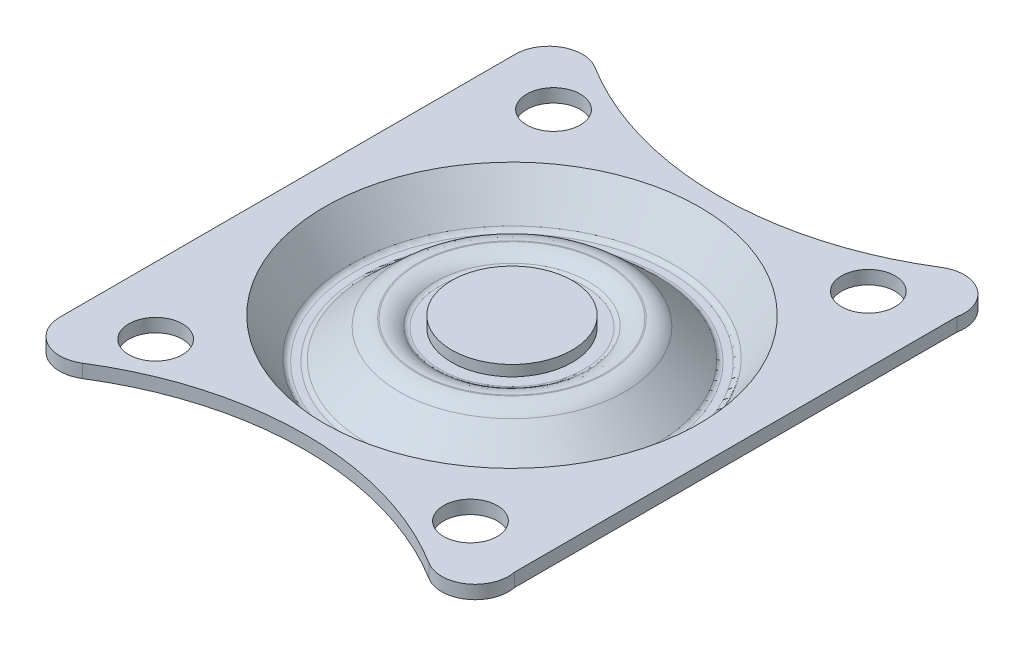
ISO-10303-21;
HEADER;
FILE_DESCRIPTION(('STEP AP214'),'2;1');
FILE_NAME('part.step','',(''),(''),'','','');
FILE_SCHEMA(('AUTOMOTIVE_DESIGN { 1 0 10303 214 1 1 1 1 }'));
ENDSEC;
DATA;
#1=APPLICATION_CONTEXT('core data for automotive mechanical design processes');
#2=APPLICATION_PROTOCOL_DEFINITION('international standard','automotive_design',2000,#1);
#3=PRODUCT_CONTEXT('',#1,'mechanical');
#4=PRODUCT('Part','Part','',(#3));
#5=PRODUCT_RELATED_PRODUCT_CATEGORY('part','',(#4));
#6=PRODUCT_DEFINITION_FORMATION('','',#4);
#7=PRODUCT_DEFINITION_CONTEXT('part definition',#1,'design');
#8=PRODUCT_DEFINITION('design','',#6,#7);
#9=PRODUCT_DEFINITION_SHAPE('','',#8);
#10=(LENGTH_UNIT() NAMED_UNIT(*) SI_UNIT(.MILLI.,.METRE.));
#11=(NAMED_UNIT(*) PLANE_ANGLE_UNIT() SI_UNIT($,.RADIAN.));
#12=(NAMED_UNIT(*) SI_UNIT($,.STERADIAN.) SOLID_ANGLE_UNIT());
#13=UNCERTAINTY_MEASURE_WITH_UNIT(LENGTH_MEASURE(1.E-05),#10,'distance_accuracy_value','');
#14=(GEOMETRIC_REPRESENTATION_CONTEXT(3) GLOBAL_UNCERTAINTY_ASSIGNED_CONTEXT((#13)) GLOBAL_UNIT_ASSIGNED_CONTEXT((#10,
#11,#12)) REPRESENTATION_CONTEXT('',''));
#15=CARTESIAN_POINT('',(0.,0.,0.));
#16=DIRECTION('',(0.,0.,1.));
#17=DIRECTION('',(1.,0.,0.));
#18=AXIS2_PLACEMENT_3D('',#15,#16,#17);
#19=CARTESIAN_POINT('',(-7.00309543866704,-1.94184567149119,-2.90077710928894));
#20=DIRECTION('',(0.,1.,0.));
#21=DIRECTION('',(-0.923879532511292,0.,-0.382683432365077));
#22=AXIS2_PLACEMENT_3D('',#19,#20,#21);
#23=SPHERICAL_SURFACE('',#22,1.5);
#24=CARTESIAN_POINT('',(-7.00309543866704,-0.441845671491192,-2.90077710928894));
#25=VERTEX_POINT('',#24);
#26=VERTEX_LOOP('',#25);
#27=FACE_BOUND('',#26,.T.);
#28=ADVANCED_FACE('F35',(#27),#23,.T.);
#29=CLOSED_SHELL('',(#28));
#30=MANIFOLD_SOLID_BREP('B2',#29);
#31=CARTESIAN_POINT('',(-5.35993719929885,-1.94184567149119,-5.35993719929872));
#32=DIRECTION('',(0.,1.,0.));
#33=DIRECTION('',(-0.707106781186556,0.,-0.707106781186539));
#34=AXIS2_PLACEMENT_3D('',#31,#32,#33);
#35=SPHERICAL_SURFACE('',#34,1.5);
#36=CARTESIAN_POINT('',(-5.35993719929885,-0.441845671491192,-5.35993719929872));
#37=VERTEX_POINT('',#36);
#38=VERTEX_LOOP('',#37);
#39=FACE_BOUND('',#38,.T.);
#40=ADVANCED_FACE('F53',(#39),#35,.T.);
#41=CLOSED_SHELL('',(#40));
#42=MANIFOLD_SOLID_BREP('B6',#41);
#43=CARTESIAN_POINT('',(-2.90077710928911,-1.94184567149119,-7.00309543866697));
#44=DIRECTION('',(0.,1.,0.));
#45=DIRECTION('',(-0.3826834323651,0.,-0.923879532511283));
#46=AXIS2_PLACEMENT_3D('',#43,#44,#45);
#47=SPHERICAL_SURFACE('',#46,1.5);
#48=CARTESIAN_POINT('',(-2.90077710928911,-0.441845671491192,-7.00309543866697));
#49=VERTEX_POINT('',#48);
#50=VERTEX_LOOP('',#49);
#51=FACE_BOUND('',#50,.T.);
#52=ADVANCED_FACE('F71',(#51),#47,.T.);
#53=CLOSED_SHELL('',(#52));
#54=MANIFOLD_SOLID_BREP('B31',#53);
#55=CARTESIAN_POINT('',(0.,-1.94184567149119,-7.5800958807164));
#56=DIRECTION('',(0.,1.,0.));
#57=DIRECTION('',(0.,0.,-1.));
#58=AXIS2_PLACEMENT_3D('',#55,#56,#57);
#59=SPHERICAL_SURFACE('',#58,1.5);
#60=CARTESIAN_POINT('',(0.,-0.441845671491192,-7.5800958807164));
#61=VERTEX_POINT('',#60);
#62=VERTEX_LOOP('',#61);
#63=FACE_BOUND('',#62,.T.);
#64=ADVANCED_FACE('F89',(#63),#59,.T.);
#65=CLOSED_SHELL('',(#64));
#66=MANIFOLD_SOLID_BREP('B49',#65);
#67=CARTESIAN_POINT('',(2.90077710928896,-1.94184567149119,-7.00309543866703));
#68=DIRECTION('',(0.,1.,0.));
#69=DIRECTION('',(0.382683432365081,0.,-0.923879532511291));
#70=AXIS2_PLACEMENT_3D('',#67,#68,#69);
#71=SPHERICAL_SURFACE('',#70,1.5);
#72=CARTESIAN_POINT('',(2.90077710928896,-0.441845671491192,-7.00309543866703));
#73=VERTEX_POINT('',#72);
#74=VERTEX_LOOP('',#73);
#75=FACE_BOUND('',#74,.T.);
#76=ADVANCED_FACE('F107',(#75),#71,.T.);
#77=CLOSED_SHELL('',(#76));
#78=MANIFOLD_SOLID_BREP('B67',#77);
#79=CARTESIAN_POINT('',(5.35993719929874,-1.94184567149119,-5.35993719929883));
#80=DIRECTION('',(0.,1.,0.));
#81=DIRECTION('',(0.707106781186541,0.,-0.707106781186554));
#82=AXIS2_PLACEMENT_3D('',#79,#80,#81);
#83=SPHERICAL_SURFACE('',#82,1.5);
#84=CARTESIAN_POINT('',(5.35993719929874,-0.441845671491192,-5.35993719929883));
#85=VERTEX_POINT('',#84);
#86=VERTEX_LOOP('',#85);
#87=FACE_BOUND('',#86,.T.);
#88=ADVANCED_FACE('F125',(#87),#83,.T.);
#89=CLOSED_SHELL('',(#88));
#90=MANIFOLD_SOLID_BREP('B85',#89);
#91=CARTESIAN_POINT('',(7.00309543866698,-1.94184567149119,-2.90077710928909));
#92=DIRECTION('',(0.,1.,0.));
#93=DIRECTION('',(0.923879532511284,0.,-0.382683432365097));
#94=AXIS2_PLACEMENT_3D('',#91,#92,#93);
#95=SPHERICAL_SURFACE('',#94,1.5);
#96=CARTESIAN_POINT('',(7.00309543866698,-0.441845671491192,-2.90077710928909));
#97=VERTEX_POINT('',#96);
#98=VERTEX_LOOP('',#97);
#99=FACE_BOUND('',#98,.T.);
#100=ADVANCED_FACE('F143',(#99),#95,.T.);
#101=CLOSED_SHELL('',(#100));
#102=MANIFOLD_SOLID_BREP('B103',#101);
#103=CARTESIAN_POINT('',(7.5800958807164,-1.94184567149119,0.));
#104=DIRECTION('',(0.,1.,0.));
#105=DIRECTION('',(1.,0.,0.));
#106=AXIS2_PLACEMENT_3D('',#103,#104,#105);
#107=SPHERICAL_SURFACE('',#106,1.5);
#108=CARTESIAN_POINT('',(7.5800958807164,-0.441845671491192,0.));
#109=VERTEX_POINT('',#108);
#110=VERTEX_LOOP('',#109);
#111=FACE_BOUND('',#110,.T.);
#112=ADVANCED_FACE('F161',(#111),#107,.T.);
#113=CLOSED_SHELL('',(#112));
#114=MANIFOLD_SOLID_BREP('B121',#113);
#115=CARTESIAN_POINT('',(7.00309543866702,-1.94184567149119,2.90077710928899));
#116=DIRECTION('',(0.,1.,0.));
#117=DIRECTION('',(0.923879532511289,0.,0.382683432365084));
#118=AXIS2_PLACEMENT_3D('',#115,#116,#117);
#119=SPHERICAL_SURFACE('',#118,1.5);
#120=CARTESIAN_POINT('',(7.00309543866702,-0.441845671491192,2.90077710928899));
#121=VERTEX_POINT('',#120);
#122=VERTEX_LOOP('',#121);
#123=FACE_BOUND('',#122,.T.);
#124=ADVANCED_FACE('F179',(#123),#119,.T.);
#125=CLOSED_SHELL('',(#124));
#126=MANIFOLD_SOLID_BREP('B139',#125);
#127=CARTESIAN_POINT('',(5.35993719929881,-1.94184567149119,5.35993719929875));
#128=DIRECTION('',(0.,1.,0.));
#129=DIRECTION('',(0.707106781186551,0.,0.707106781186544));
#130=AXIS2_PLACEMENT_3D('',#127,#128,#129);
#131=SPHERICAL_SURFACE('',#130,1.5);
#132=CARTESIAN_POINT('',(5.35993719929881,-0.441845671491192,5.35993719929875));
#133=VERTEX_POINT('',#132);
#134=VERTEX_LOOP('',#133);
#135=FACE_BOUND('',#134,.T.);
#136=ADVANCED_FACE('F197',(#135),#131,.T.);
#137=CLOSED_SHELL('',(#136));
#138=MANIFOLD_SOLID_BREP('B157',#137);
#139=CARTESIAN_POINT('',(2.90077710928906,-1.94184567149119,7.00309543866699));
#140=DIRECTION('',(0.,1.,0.));
#141=DIRECTION('',(0.382683432365094,0.,0.923879532511285));
#142=AXIS2_PLACEMENT_3D('',#139,#140,#141);
#143=SPHERICAL_SURFACE('',#142,1.5);
#144=CARTESIAN_POINT('',(2.90077710928906,-0.441845671491192,7.00309543866699));
#145=VERTEX_POINT('',#144);
#146=VERTEX_LOOP('',#145);
#147=FACE_BOUND('',#146,.T.);
#148=ADVANCED_FACE('F215',(#147),#143,.T.);
#149=CLOSED_SHELL('',(#148));
#150=MANIFOLD_SOLID_BREP('B175',#149);
#151=CARTESIAN_POINT('',(0.,-1.94184567149119,7.5800958807164));
#152=DIRECTION('',(0.,1.,0.));
#153=DIRECTION('',(0.,0.,1.));
#154=AXIS2_PLACEMENT_3D('',#151,#152,#153);
#155=SPHERICAL_SURFACE('',#154,1.5);
#156=CARTESIAN_POINT('',(0.,-0.441845671491192,7.5800958807164));
#157=VERTEX_POINT('',#156);
#158=VERTEX_LOOP('',#157);
#159=FACE_BOUND('',#158,.T.);
#160=ADVANCED_FACE('F233',(#159),#155,.T.);
#161=CLOSED_SHELL('',(#160));
#162=MANIFOLD_SOLID_BREP('B193',#161);
#163=CARTESIAN_POINT('',(-2.90077710928901,-1.94184567149119,7.00309543866701));
#164=DIRECTION('',(0.,1.,0.));
#165=DIRECTION('',(-0.382683432365087,0.,0.923879532511288));
#166=AXIS2_PLACEMENT_3D('',#163,#164,#165);
#167=SPHERICAL_SURFACE('',#166,1.5);
#168=CARTESIAN_POINT('',(-2.90077710928901,-0.441845671491192,7.00309543866701));
#169=VERTEX_POINT('',#168);
#170=VERTEX_LOOP('',#169);
#171=FACE_BOUND('',#170,.T.);
#172=ADVANCED_FACE('F251',(#171),#167,.T.);
#173=CLOSED_SHELL('',(#172));
#174=MANIFOLD_SOLID_BREP('B211',#173);
#175=CARTESIAN_POINT('',(-5.35993719929877,-1.94184567149119,5.35993719929879));
#176=DIRECTION('',(0.,1.,0.));
#177=DIRECTION('',(-0.707106781186546,0.,0.707106781186549));
#178=AXIS2_PLACEMENT_3D('',#175,#176,#177);
#179=SPHERICAL_SURFACE('',#178,1.5);
#180=CARTESIAN_POINT('',(-5.35993719929877,-0.441845671491192,5.35993719929879));
#181=VERTEX_POINT('',#180);
#182=VERTEX_LOOP('',#181);
#183=FACE_BOUND('',#182,.T.);
#184=ADVANCED_FACE('F269',(#183),#179,.T.);
#185=CLOSED_SHELL('',(#184));
#186=MANIFOLD_SOLID_BREP('B229',#185);
#187=CARTESIAN_POINT('',(-7.003095438667,-1.94184567149119,2.90077710928904));
#188=DIRECTION('',(0.,1.,0.));
#189=DIRECTION('',(-0.923879532511287,0.,0.382683432365091));
#190=AXIS2_PLACEMENT_3D('',#187,#188,#189);
#191=SPHERICAL_SURFACE('',#190,1.5);
#192=CARTESIAN_POINT('',(-7.003095438667,-0.441845671491192,2.90077710928904));
#193=VERTEX_POINT('',#192);
#194=VERTEX_LOOP('',#193);
#195=FACE_BOUND('',#194,.T.);
#196=ADVANCED_FACE('F287',(#195),#191,.T.);
#197=CLOSED_SHELL('',(#196));
#198=MANIFOLD_SOLID_BREP('B247',#197);
#199=CARTESIAN_POINT('',(-7.5800958807164,-1.94184567149119,0.));
#200=DIRECTION('',(0.,1.,0.));
#201=DIRECTION('',(-1.,0.,0.));
#202=AXIS2_PLACEMENT_3D('',#199,#200,#201);
#203=SPHERICAL_SURFACE('',#202,1.5);
#204=CARTESIAN_POINT('',(-7.5800958807164,-0.441845671491192,0.));
#205=VERTEX_POINT('',#204);
#206=VERTEX_LOOP('',#205);
#207=FACE_BOUND('',#206,.T.);
#208=ADVANCED_FACE('F308',(#207),#203,.T.);
#209=CLOSED_SHELL('',(#208));
#210=MANIFOLD_SOLID_BREP('B265',#209);
#211=CARTESIAN_POINT('',(14.25,0.,-17.));
#212=DIRECTION('',(0.,-1.,0.));
#213=DIRECTION('',(0.,0.,-1.));
#214=AXIS2_PLACEMENT_3D('',#211,#212,#213);
#215=PLANE('',#214);
#216=CARTESIAN_POINT('',(11.75,0.,-14.85));
#217=DIRECTION('',(0.,1.,0.));
#218=DIRECTION('',(0.,0.,1.));
#219=AXIS2_PLACEMENT_3D('',#216,#217,#218);
#220=CIRCLE('',#219,2.);
#221=CARTESIAN_POINT('',(11.75,0.,-12.85));
#222=VERTEX_POINT('',#221);
#223=EDGE_CURVE('E678',#222,#222,#220,.T.);
#224=ORIENTED_EDGE('',*,*,#223,.T.);
#225=EDGE_LOOP('',(#224));
#226=FACE_BOUND('',#225,.T.);
#227=CARTESIAN_POINT('',(-11.75,0.,-14.85));
#228=DIRECTION('',(0.,1.,0.));
#229=DIRECTION('',(0.,0.,-1.));
#230=AXIS2_PLACEMENT_3D('',#227,#228,#229);
#231=CIRCLE('',#230,2.);
#232=CARTESIAN_POINT('',(-11.75,0.,-16.85));
#233=VERTEX_POINT('',#232);
#234=EDGE_CURVE('E632',#233,#233,#231,.T.);
#235=ORIENTED_EDGE('',*,*,#234,.T.);
#236=EDGE_LOOP('',(#235));
#237=FACE_BOUND('',#236,.T.);
#238=CARTESIAN_POINT('',(14.25,0.,-17.));
#239=DIRECTION('',(0.,1.,0.));
#240=DIRECTION('',(0.,0.,-1.));
#241=AXIS2_PLACEMENT_3D('',#238,#239,#240);
#242=CIRCLE('',#241,2.5);
#243=CARTESIAN_POINT('',(16.6994897427832,0.,-16.5));
#244=VERTEX_POINT('',#243);
#245=CARTESIAN_POINT('',(12.9284561027765,0.,-19.1221502603989));
#246=VERTEX_POINT('',#245);
#247=EDGE_CURVE('E419',#244,#246,#242,.T.);
#248=ORIENTED_EDGE('',*,*,#247,.F.);
#249=DIRECTION('',(0.,0.,-1.));
#250=VECTOR('',#249,1.);
#251=CARTESIAN_POINT('',(16.6994897427832,0.,16.5));
#252=LINE('',#251,#250);
#253=CARTESIAN_POINT('',(16.6994897427832,0.,16.5));
#254=VERTEX_POINT('',#253);
#255=EDGE_CURVE('E372',#254,#244,#252,.T.);
#256=ORIENTED_EDGE('',*,*,#255,.F.);
#257=CARTESIAN_POINT('',(14.25,0.,17.));
#258=DIRECTION('',(0.,1.,0.));
#259=DIRECTION('',(0.,0.,1.));
#260=AXIS2_PLACEMENT_3D('',#257,#258,#259);
#261=CIRCLE('',#260,2.5);
#262=CARTESIAN_POINT('',(12.9284561027765,0.,19.1221502603989));
#263=VERTEX_POINT('',#262);
#264=EDGE_CURVE('E366',#263,#254,#261,.T.);
#265=ORIENTED_EDGE('',*,*,#264,.F.);
#266=CARTESIAN_POINT('',(0.,0.,39.8828125));
#267=DIRECTION('',(0.,-1.,0.));
#268=DIRECTION('',(0.,0.,-1.));
#269=AXIS2_PLACEMENT_3D('',#266,#267,#268);
#270=CIRCLE('',#269,24.457106816388);
#271=CARTESIAN_POINT('',(-12.9284561027765,0.,19.122150260399));
#272=VERTEX_POINT('',#271);
#273=EDGE_CURVE('E409',#272,#263,#270,.T.);
#274=ORIENTED_EDGE('',*,*,#273,.F.);
#275=CARTESIAN_POINT('',(-14.25,0.,17.));
#276=DIRECTION('',(0.,1.,0.));
#277=DIRECTION('',(0.,0.,-1.));
#278=AXIS2_PLACEMENT_3D('',#275,#276,#277);
#279=CIRCLE('',#278,2.5);
#280=CARTESIAN_POINT('',(-16.75,0.,17.));
#281=VERTEX_POINT('',#280);
#282=EDGE_CURVE('E429',#281,#272,#279,.T.);
#283=ORIENTED_EDGE('',*,*,#282,.F.);
#284=DIRECTION('',(0.,0.,1.));
#285=VECTOR('',#284,1.);
#286=CARTESIAN_POINT('',(-16.75,0.,17.));
#287=LINE('',#286,#285);
#288=CARTESIAN_POINT('',(-16.75,0.,-17.));
#289=VERTEX_POINT('',#288);
#290=EDGE_CURVE('E427',#289,#281,#287,.T.);
#291=ORIENTED_EDGE('',*,*,#290,.F.);
#292=CARTESIAN_POINT('',(-14.25,0.,-17.));
#293=DIRECTION('',(0.,1.,0.));
#294=DIRECTION('',(0.,0.,1.));
#295=AXIS2_PLACEMENT_3D('',#292,#293,#294);
#296=CIRCLE('',#295,2.5);
#297=CARTESIAN_POINT('',(-12.9284561027765,0.,-19.1221502603989));
#298=VERTEX_POINT('',#297);
#299=EDGE_CURVE('E425',#298,#289,#296,.T.);
#300=ORIENTED_EDGE('',*,*,#299,.F.);
#301=CARTESIAN_POINT('',(0.,0.,-39.8828125));
#302=DIRECTION('',(0.,-1.,0.));
#303=DIRECTION('',(0.,0.,1.));
#304=AXIS2_PLACEMENT_3D('',#301,#302,#303);
#305=CIRCLE('',#304,24.457106816388);
#306=EDGE_CURVE('E422',#246,#298,#305,.T.);
#307=ORIENTED_EDGE('',*,*,#306,.F.);
#308=EDGE_LOOP('',(#248,#256,#265,#274,#283,#291,#300,#307));
#309=FACE_BOUND('',#308,.T.);
#310=CARTESIAN_POINT('',(-11.75,0.,14.85));
#311=DIRECTION('',(0.,1.,0.));
#312=DIRECTION('',(0.,0.,1.));
#313=AXIS2_PLACEMENT_3D('',#310,#311,#312);
#314=CIRCLE('',#313,2.);
#315=CARTESIAN_POINT('',(-11.75,0.,16.85));
#316=VERTEX_POINT('',#315);
#317=EDGE_CURVE('E626',#316,#316,#314,.T.);
#318=ORIENTED_EDGE('',*,*,#317,.T.);
#319=EDGE_LOOP('',(#318));
#320=FACE_BOUND('',#319,.T.);
#321=CARTESIAN_POINT('',(11.75,0.,14.85));
#322=DIRECTION('',(0.,1.,0.));
#323=DIRECTION('',(0.,0.,-1.));
#324=AXIS2_PLACEMENT_3D('',#321,#322,#323);
#325=CIRCLE('',#324,2.);
#326=CARTESIAN_POINT('',(11.75,0.,12.85));
#327=VERTEX_POINT('',#326);
#328=EDGE_CURVE('E656',#327,#327,#325,.T.);
#329=ORIENTED_EDGE('',*,*,#328,.T.);
#330=EDGE_LOOP('',(#329));
#331=FACE_BOUND('',#330,.T.);
#332=CARTESIAN_POINT('',(0.,0.,0.));
#333=DIRECTION('',(0.,-1.,0.));
#334=DIRECTION('',(0.,0.,-1.));
#335=AXIS2_PLACEMENT_3D('',#332,#333,#334);
#336=CIRCLE('',#335,14.5276964551768);
#337=CARTESIAN_POINT('',(0.,0.,-14.5276964551768));
#338=VERTEX_POINT('',#337);
#339=EDGE_CURVE('E659',#338,#338,#336,.T.);
#340=ORIENTED_EDGE('',*,*,#339,.F.);
#341=EDGE_LOOP('',(#340));
#342=FACE_BOUND('',#341,.T.);
#343=ADVANCED_FACE('F320',(#226,#237,#309,#320,#331,#342),#215,.T.);
#344=CARTESIAN_POINT('',(14.25,1.,-17.));
#345=DIRECTION('',(0.,-1.,0.));
#346=DIRECTION('',(0.,0.,-1.));
#347=AXIS2_PLACEMENT_3D('',#344,#345,#346);
#348=PLANE('',#347);
#349=CARTESIAN_POINT('',(0.,1.,0.));
#350=DIRECTION('',(0.,1.,0.));
#351=DIRECTION('',(0.,0.,1.));
#352=AXIS2_PLACEMENT_3D('',#349,#350,#351);
#353=CIRCLE('',#352,14.);
#354=CARTESIAN_POINT('',(0.,1.,14.));
#355=VERTEX_POINT('',#354);
#356=EDGE_CURVE('E675',#355,#355,#353,.T.);
#357=ORIENTED_EDGE('',*,*,#356,.F.);
#358=EDGE_LOOP('',(#357));
#359=FACE_BOUND('',#358,.T.);
#360=CARTESIAN_POINT('',(11.75,1.,14.85));
#361=DIRECTION('',(0.,1.,0.));
#362=DIRECTION('',(0.,0.,-1.));
#363=AXIS2_PLACEMENT_3D('',#360,#361,#362);
#364=CIRCLE('',#363,2.);
#365=CARTESIAN_POINT('',(11.75,1.,12.85));
#366=VERTEX_POINT('',#365);
#367=EDGE_CURVE('E683',#366,#366,#364,.T.);
#368=ORIENTED_EDGE('',*,*,#367,.F.);
#369=EDGE_LOOP('',(#368));
#370=FACE_BOUND('',#369,.T.);
#371=CARTESIAN_POINT('',(-11.75,1.,14.85));
#372=DIRECTION('',(0.,1.,0.));
#373=DIRECTION('',(0.,0.,1.));
#374=AXIS2_PLACEMENT_3D('',#371,#372,#373);
#375=CIRCLE('',#374,2.);
#376=CARTESIAN_POINT('',(-11.75,1.,16.85));
#377=VERTEX_POINT('',#376);
#378=EDGE_CURVE('E423',#377,#377,#375,.T.);
#379=ORIENTED_EDGE('',*,*,#378,.F.);
#380=EDGE_LOOP('',(#379));
#381=FACE_BOUND('',#380,.T.);
#382=CARTESIAN_POINT('',(14.25,1.,-17.));
#383=DIRECTION('',(0.,1.,0.));
#384=DIRECTION('',(0.,0.,-1.));
#385=AXIS2_PLACEMENT_3D('',#382,#383,#384);
#386=CIRCLE('',#385,2.5);
#387=CARTESIAN_POINT('',(16.6994897427832,1.,-16.5));
#388=VERTEX_POINT('',#387);
#389=CARTESIAN_POINT('',(12.9284561027765,1.,-19.1221502603989));
#390=VERTEX_POINT('',#389);
#391=EDGE_CURVE('E434',#388,#390,#386,.T.);
#392=ORIENTED_EDGE('',*,*,#391,.T.);
#393=CARTESIAN_POINT('',(0.,1.,-39.8828125));
#394=DIRECTION('',(0.,-1.,0.));
#395=DIRECTION('',(0.,0.,1.));
#396=AXIS2_PLACEMENT_3D('',#393,#394,#395);
#397=CIRCLE('',#396,24.457106816388);
#398=CARTESIAN_POINT('',(-12.9284561027765,1.,-19.1221502603989));
#399=VERTEX_POINT('',#398);
#400=EDGE_CURVE('E381',#390,#399,#397,.T.);
#401=ORIENTED_EDGE('',*,*,#400,.T.);
#402=CARTESIAN_POINT('',(-14.25,1.,-17.));
#403=DIRECTION('',(0.,1.,0.));
#404=DIRECTION('',(0.,0.,1.));
#405=AXIS2_PLACEMENT_3D('',#402,#403,#404);
#406=CIRCLE('',#405,2.5);
#407=CARTESIAN_POINT('',(-16.75,1.,-17.));
#408=VERTEX_POINT('',#407);
#409=EDGE_CURVE('E638',#399,#408,#406,.T.);
#410=ORIENTED_EDGE('',*,*,#409,.T.);
#411=DIRECTION('',(0.,0.,1.));
#412=VECTOR('',#411,1.);
#413=CARTESIAN_POINT('',(-16.75,1.,17.));
#414=LINE('',#413,#412);
#415=CARTESIAN_POINT('',(-16.75,1.,17.));
#416=VERTEX_POINT('',#415);
#417=EDGE_CURVE('E640',#408,#416,#414,.T.);
#418=ORIENTED_EDGE('',*,*,#417,.T.);
#419=CARTESIAN_POINT('',(-14.25,1.,17.));
#420=DIRECTION('',(0.,1.,0.));
#421=DIRECTION('',(0.,0.,-1.));
#422=AXIS2_PLACEMENT_3D('',#419,#420,#421);
#423=CIRCLE('',#422,2.5);
#424=CARTESIAN_POINT('',(-12.9284561027765,1.,19.122150260399));
#425=VERTEX_POINT('',#424);
#426=EDGE_CURVE('E401',#416,#425,#423,.T.);
#427=ORIENTED_EDGE('',*,*,#426,.T.);
#428=CARTESIAN_POINT('',(0.,1.,39.8828125));
#429=DIRECTION('',(0.,-1.,0.));
#430=DIRECTION('',(0.,0.,-1.));
#431=AXIS2_PLACEMENT_3D('',#428,#429,#430);
#432=CIRCLE('',#431,24.457106816388);
#433=CARTESIAN_POINT('',(12.9284561027765,1.,19.1221502603989));
#434=VERTEX_POINT('',#433);
#435=EDGE_CURVE('E394',#425,#434,#432,.T.);
#436=ORIENTED_EDGE('',*,*,#435,.T.);
#437=CARTESIAN_POINT('',(14.25,1.,17.));
#438=DIRECTION('',(0.,1.,0.));
#439=DIRECTION('',(0.,0.,1.));
#440=AXIS2_PLACEMENT_3D('',#437,#438,#439);
#441=CIRCLE('',#440,2.5);
#442=CARTESIAN_POINT('',(16.6994897427832,1.,16.5));
#443=VERTEX_POINT('',#442);
#444=EDGE_CURVE('E399',#434,#443,#441,.T.);
#445=ORIENTED_EDGE('',*,*,#444,.T.);
#446=DIRECTION('',(0.,0.,-1.));
#447=VECTOR('',#446,1.);
#448=CARTESIAN_POINT('',(16.6994897427832,1.,16.5));
#449=LINE('',#448,#447);
#450=EDGE_CURVE('E337',#443,#388,#449,.T.);
#451=ORIENTED_EDGE('',*,*,#450,.T.);
#452=EDGE_LOOP('',(#392,#401,#410,#418,#427,#436,#445,#451));
#453=FACE_BOUND('',#452,.T.);
#454=CARTESIAN_POINT('',(-11.75,1.,-14.85));
#455=DIRECTION('',(0.,1.,0.));
#456=DIRECTION('',(0.,0.,-1.));
#457=AXIS2_PLACEMENT_3D('',#454,#455,#456);
#458=CIRCLE('',#457,2.);
#459=CARTESIAN_POINT('',(-11.75,1.,-16.85));
#460=VERTEX_POINT('',#459);
#461=EDGE_CURVE('E628',#460,#460,#458,.T.);
#462=ORIENTED_EDGE('',*,*,#461,.F.);
#463=EDGE_LOOP('',(#462));
#464=FACE_BOUND('',#463,.T.);
#465=CARTESIAN_POINT('',(11.75,1.,-14.85));
#466=DIRECTION('',(0.,1.,0.));
#467=DIRECTION('',(0.,0.,1.));
#468=AXIS2_PLACEMENT_3D('',#465,#466,#467);
#469=CIRCLE('',#468,2.);
#470=CARTESIAN_POINT('',(11.75,1.,-12.85));
#471=VERTEX_POINT('',#470);
#472=EDGE_CURVE('E679',#471,#471,#469,.T.);
#473=ORIENTED_EDGE('',*,*,#472,.F.);
#474=EDGE_LOOP('',(#473));
#475=FACE_BOUND('',#474,.T.);
#476=ADVANCED_FACE('F396',(#359,#370,#381,#453,#464,#475),#348,.F.);
#477=CARTESIAN_POINT('',(14.25,1.,-17.));
#478=DIRECTION('',(0.,-1.,0.));
#479=DIRECTION('',(0.,0.,-1.));
#480=AXIS2_PLACEMENT_3D('',#477,#478,#479);
#481=CYLINDRICAL_SURFACE('',#480,2.5);
#482=ORIENTED_EDGE('',*,*,#247,.T.);
#483=DIRECTION('',(0.,-1.,0.));
#484=VECTOR('',#483,1.);
#485=CARTESIAN_POINT('',(12.9284561027765,1.,-19.1221502603989));
#486=LINE('',#485,#484);
#487=EDGE_CURVE('E447',#390,#246,#486,.T.);
#488=ORIENTED_EDGE('',*,*,#487,.F.);
#489=ORIENTED_EDGE('',*,*,#391,.F.);
#490=DIRECTION('',(0.,-1.,0.));
#491=VECTOR('',#490,1.);
#492=CARTESIAN_POINT('',(16.6994897427832,1.,-16.5));
#493=LINE('',#492,#491);
#494=EDGE_CURVE('E415',#388,#244,#493,.T.);
#495=ORIENTED_EDGE('',*,*,#494,.T.);
#496=EDGE_LOOP('',(#482,#488,#489,#495));
#497=FACE_BOUND('',#496,.T.);
#498=ADVANCED_FACE('F512',(#497),#481,.T.);
#499=CARTESIAN_POINT('',(0.,1.,-39.8828125));
#500=DIRECTION('',(0.,-1.,0.));
#501=DIRECTION('',(0.,0.,-1.));
#502=AXIS2_PLACEMENT_3D('',#499,#500,#501);
#503=CYLINDRICAL_SURFACE('',#502,24.457106816388);
#504=ORIENTED_EDGE('',*,*,#306,.T.);
#505=DIRECTION('',(0.,-1.,0.));
#506=VECTOR('',#505,1.);
#507=CARTESIAN_POINT('',(-12.9284561027765,1.,-19.1221502603989));
#508=LINE('',#507,#506);
#509=EDGE_CURVE('E444',#399,#298,#508,.T.);
#510=ORIENTED_EDGE('',*,*,#509,.F.);
#511=ORIENTED_EDGE('',*,*,#400,.F.);
#512=ORIENTED_EDGE('',*,*,#487,.T.);
#513=EDGE_LOOP('',(#504,#510,#511,#512));
#514=FACE_BOUND('',#513,.T.);
#515=ADVANCED_FACE('F538',(#514),#503,.F.);
#516=CARTESIAN_POINT('',(-14.25,1.,-17.));
#517=DIRECTION('',(0.,-1.,0.));
#518=DIRECTION('',(0.,0.,-1.));
#519=AXIS2_PLACEMENT_3D('',#516,#517,#518);
#520=CYLINDRICAL_SURFACE('',#519,2.5);
#521=ORIENTED_EDGE('',*,*,#299,.T.);
#522=DIRECTION('',(0.,-1.,0.));
#523=VECTOR('',#522,1.);
#524=CARTESIAN_POINT('',(-16.75,1.,-17.));
#525=LINE('',#524,#523);
#526=EDGE_CURVE('E441',#408,#289,#525,.T.);
#527=ORIENTED_EDGE('',*,*,#526,.F.);
#528=ORIENTED_EDGE('',*,*,#409,.F.);
#529=ORIENTED_EDGE('',*,*,#509,.T.);
#530=EDGE_LOOP('',(#521,#527,#528,#529));
#531=FACE_BOUND('',#530,.T.);
#532=ADVANCED_FACE('F534',(#531),#520,.T.);
#533=CARTESIAN_POINT('',(-16.75,1.,17.));
#534=DIRECTION('',(1.,0.,0.));
#535=DIRECTION('',(0.,0.,-1.));
#536=AXIS2_PLACEMENT_3D('',#533,#534,#535);
#537=PLANE('',#536);
#538=ORIENTED_EDGE('',*,*,#290,.T.);
#539=DIRECTION('',(0.,-1.,0.));
#540=VECTOR('',#539,1.);
#541=CARTESIAN_POINT('',(-16.75,1.,17.));
#542=LINE('',#541,#540);
#543=EDGE_CURVE('E438',#416,#281,#542,.T.);
#544=ORIENTED_EDGE('',*,*,#543,.F.);
#545=ORIENTED_EDGE('',*,*,#417,.F.);
#546=ORIENTED_EDGE('',*,*,#526,.T.);
#547=EDGE_LOOP('',(#538,#544,#545,#546));
#548=FACE_BOUND('',#547,.T.);
#549=ADVANCED_FACE('F530',(#548),#537,.F.);
#550=CARTESIAN_POINT('',(-14.25,1.,17.));
#551=DIRECTION('',(0.,-1.,0.));
#552=DIRECTION('',(0.,0.,-1.));
#553=AXIS2_PLACEMENT_3D('',#550,#551,#552);
#554=CYLINDRICAL_SURFACE('',#553,2.5);
#555=ORIENTED_EDGE('',*,*,#282,.T.);
#556=DIRECTION('',(0.,-1.,0.));
#557=VECTOR('',#556,1.);
#558=CARTESIAN_POINT('',(-12.9284561027765,1.,19.122150260399));
#559=LINE('',#558,#557);
#560=EDGE_CURVE('E410',#425,#272,#559,.T.);
#561=ORIENTED_EDGE('',*,*,#560,.F.);
#562=ORIENTED_EDGE('',*,*,#426,.F.);
#563=ORIENTED_EDGE('',*,*,#543,.T.);
#564=EDGE_LOOP('',(#555,#561,#562,#563));
#565=FACE_BOUND('',#564,.T.);
#566=ADVANCED_FACE('F527',(#565),#554,.T.);
#567=CARTESIAN_POINT('',(0.,1.,39.8828125));
#568=DIRECTION('',(0.,-1.,0.));
#569=DIRECTION('',(0.,0.,-1.));
#570=AXIS2_PLACEMENT_3D('',#567,#568,#569);
#571=CYLINDRICAL_SURFACE('',#570,24.457106816388);
#572=ORIENTED_EDGE('',*,*,#273,.T.);
#573=DIRECTION('',(0.,-1.,0.));
#574=VECTOR('',#573,1.);
#575=CARTESIAN_POINT('',(12.9284561027765,1.,19.1221502603989));
#576=LINE('',#575,#574);
#577=EDGE_CURVE('E406',#434,#263,#576,.T.);
#578=ORIENTED_EDGE('',*,*,#577,.F.);
#579=ORIENTED_EDGE('',*,*,#435,.F.);
#580=ORIENTED_EDGE('',*,*,#560,.T.);
#581=EDGE_LOOP('',(#572,#578,#579,#580));
#582=FACE_BOUND('',#581,.T.);
#583=ADVANCED_FACE('F407',(#582),#571,.F.);
#584=CARTESIAN_POINT('',(14.25,1.,17.));
#585=DIRECTION('',(0.,-1.,0.));
#586=DIRECTION('',(0.,0.,-1.));
#587=AXIS2_PLACEMENT_3D('',#584,#585,#586);
#588=CYLINDRICAL_SURFACE('',#587,2.5);
#589=ORIENTED_EDGE('',*,*,#264,.T.);
#590=DIRECTION('',(0.,-1.,0.));
#591=VECTOR('',#590,1.);
#592=CARTESIAN_POINT('',(16.6994897427832,1.,16.5));
#593=LINE('',#592,#591);
#594=EDGE_CURVE('E411',#443,#254,#593,.T.);
#595=ORIENTED_EDGE('',*,*,#594,.F.);
#596=ORIENTED_EDGE('',*,*,#444,.F.);
#597=ORIENTED_EDGE('',*,*,#577,.T.);
#598=EDGE_LOOP('',(#589,#595,#596,#597));
#599=FACE_BOUND('',#598,.T.);
#600=ADVANCED_FACE('F413',(#599),#588,.T.);
#601=CARTESIAN_POINT('',(16.6994897427832,1.,16.5));
#602=DIRECTION('',(-1.,0.,0.));
#603=DIRECTION('',(0.,0.,1.));
#604=AXIS2_PLACEMENT_3D('',#601,#602,#603);
#605=PLANE('',#604);
#606=ORIENTED_EDGE('',*,*,#255,.T.);
#607=ORIENTED_EDGE('',*,*,#494,.F.);
#608=ORIENTED_EDGE('',*,*,#450,.F.);
#609=ORIENTED_EDGE('',*,*,#594,.T.);
#610=EDGE_LOOP('',(#606,#607,#608,#609));
#611=FACE_BOUND('',#610,.T.);
#612=ADVANCED_FACE('F519',(#611),#605,.F.);
#613=CARTESIAN_POINT('',(-11.75,1.,14.85));
#614=DIRECTION('',(0.,-1.,0.));
#615=DIRECTION('',(0.,0.,-1.));
#616=AXIS2_PLACEMENT_3D('',#613,#614,#615);
#617=CYLINDRICAL_SURFACE('',#616,2.);
#618=ORIENTED_EDGE('',*,*,#378,.T.);
#619=EDGE_LOOP('',(#618));
#620=FACE_BOUND('',#619,.T.);
#621=ORIENTED_EDGE('',*,*,#317,.F.);
#622=EDGE_LOOP('',(#621));
#623=FACE_BOUND('',#622,.T.);
#624=ADVANCED_FACE('F522',(#620,#623),#617,.F.);
#625=CARTESIAN_POINT('',(-11.75,1.,-14.85));
#626=DIRECTION('',(0.,-1.,0.));
#627=DIRECTION('',(0.,0.,-1.));
#628=AXIS2_PLACEMENT_3D('',#625,#626,#627);
#629=CYLINDRICAL_SURFACE('',#628,2.);
#630=ORIENTED_EDGE('',*,*,#461,.T.);
#631=EDGE_LOOP('',(#630));
#632=FACE_BOUND('',#631,.T.);
#633=ORIENTED_EDGE('',*,*,#234,.F.);
#634=EDGE_LOOP('',(#633));
#635=FACE_BOUND('',#634,.T.);
#636=ADVANCED_FACE('F613',(#632,#635),#629,.F.);
#637=CARTESIAN_POINT('',(11.75,1.,14.85));
#638=DIRECTION('',(0.,-1.,0.));
#639=DIRECTION('',(0.,0.,-1.));
#640=AXIS2_PLACEMENT_3D('',#637,#638,#639);
#641=CYLINDRICAL_SURFACE('',#640,2.);
#642=ORIENTED_EDGE('',*,*,#367,.T.);
#643=EDGE_LOOP('',(#642));
#644=FACE_BOUND('',#643,.T.);
#645=ORIENTED_EDGE('',*,*,#328,.F.);
#646=EDGE_LOOP('',(#645));
#647=FACE_BOUND('',#646,.T.);
#648=ADVANCED_FACE('F609',(#644,#647),#641,.F.);
#649=CARTESIAN_POINT('',(11.75,1.,-14.85));
#650=DIRECTION('',(0.,-1.,0.));
#651=DIRECTION('',(0.,0.,-1.));
#652=AXIS2_PLACEMENT_3D('',#649,#650,#651);
#653=CYLINDRICAL_SURFACE('',#652,2.);
#654=ORIENTED_EDGE('',*,*,#472,.T.);
#655=EDGE_LOOP('',(#654));
#656=FACE_BOUND('',#655,.T.);
#657=ORIENTED_EDGE('',*,*,#223,.F.);
#658=EDGE_LOOP('',(#657));
#659=FACE_BOUND('',#658,.T.);
#660=ADVANCED_FACE('F605',(#656,#659),#653,.F.);
#661=CARTESIAN_POINT('',(-5.75,0.200000000000002,0.));
#662=DIRECTION('',(0.,-1.,0.));
#663=DIRECTION('',(0.,0.,-1.));
#664=AXIS2_PLACEMENT_3D('',#661,#662,#663);
#665=PLANE('',#664);
#666=CARTESIAN_POINT('',(0.,0.200000000000001,0.));
#667=DIRECTION('',(0.,-1.,0.));
#668=DIRECTION('',(0.,0.,-1.));
#669=AXIS2_PLACEMENT_3D('',#666,#667,#668);
#670=CIRCLE('',#669,4.5);
#671=CARTESIAN_POINT('',(0.,0.200000000000001,-4.5));
#672=VERTEX_POINT('',#671);
#673=EDGE_CURVE('E490',#672,#672,#670,.T.);
#674=ORIENTED_EDGE('',*,*,#673,.T.);
#675=EDGE_LOOP('',(#674));
#676=FACE_BOUND('',#675,.T.);
#677=CARTESIAN_POINT('',(0.,0.200000000000002,0.));
#678=DIRECTION('',(0.,-1.,0.));
#679=DIRECTION('',(0.,0.,-1.));
#680=AXIS2_PLACEMENT_3D('',#677,#678,#679);
#681=CIRCLE('',#680,5.38905080109867);
#682=CARTESIAN_POINT('',(0.,0.200000000000002,-5.38905080109867));
#683=VERTEX_POINT('',#682);
#684=EDGE_CURVE('E470',#683,#683,#681,.F.);
#685=ORIENTED_EDGE('',*,*,#684,.T.);
#686=EDGE_LOOP('',(#685));
#687=FACE_BOUND('',#686,.T.);
#688=ADVANCED_FACE('F608',(#676,#687),#665,.F.);
#689=CARTESIAN_POINT('',(-7.8681755341403,0.8,0.));
#690=DIRECTION('',(0.,-1.,0.));
#691=DIRECTION('',(0.,0.,-1.));
#692=AXIS2_PLACEMENT_3D('',#689,#690,#691);
#693=PLANE('',#692);
#694=CARTESIAN_POINT('',(0.,0.8,0.));
#695=DIRECTION('',(0.,-1.,0.));
#696=DIRECTION('',(0.,0.,-1.));
#697=AXIS2_PLACEMENT_3D('',#694,#695,#696);
#698=CIRCLE('',#697,7.01385848202586);
#699=CARTESIAN_POINT('',(0.,0.8,-7.01385848202586));
#700=VERTEX_POINT('',#699);
#701=EDGE_CURVE('E479',#700,#700,#698,.T.);
#702=ORIENTED_EDGE('',*,*,#701,.T.);
#703=EDGE_LOOP('',(#702));
#704=FACE_BOUND('',#703,.T.);
#705=CARTESIAN_POINT('',(0.,0.8,0.));
#706=DIRECTION('',(0.,-1.,0.));
#707=DIRECTION('',(0.,0.,-1.));
#708=AXIS2_PLACEMENT_3D('',#705,#706,#707);
#709=CIRCLE('',#708,7.09511517356697);
#710=CARTESIAN_POINT('',(0.,0.8,-7.09511517356697));
#711=VERTEX_POINT('',#710);
#712=EDGE_CURVE('E476',#711,#711,#709,.F.);
#713=ORIENTED_EDGE('',*,*,#712,.T.);
#714=EDGE_LOOP('',(#713));
#715=FACE_BOUND('',#714,.T.);
#716=ADVANCED_FACE('F587',(#704,#715),#693,.F.);
#717=CARTESIAN_POINT('',(0.,0.8,0.));
#718=DIRECTION('',(0.,-1.,0.));
#719=DIRECTION('',(0.,0.,-1.));
#720=AXIS2_PLACEMENT_3D('',#717,#718,#719);
#721=CONICAL_SURFACE('',#720,7.8681755341403,0.833114713855103);
#722=CARTESIAN_POINT('',(0.,0.280059666190137,0.));
#723=DIRECTION('',(0.,1.,0.));
#724=DIRECTION('',(0.,0.,1.));
#725=AXIS2_PLACEMENT_3D('',#722,#723,#724);
#726=CIRCLE('',#725,8.4402632637478);
#727=CARTESIAN_POINT('',(0.,0.280059666190137,8.4402632637478));
#728=VERTEX_POINT('',#727);
#729=EDGE_CURVE('E485',#728,#728,#726,.F.);
#730=ORIENTED_EDGE('',*,*,#729,.T.);
#731=EDGE_LOOP('',(#730));
#732=FACE_BOUND('',#731,.T.);
#733=CARTESIAN_POINT('',(0.,-1.87001491654753,0.));
#734=DIRECTION('',(0.,-1.,0.));
#735=DIRECTION('',(0.,0.,-1.));
#736=AXIS2_PLACEMENT_3D('',#733,#734,#735);
#737=CIRCLE('',#736,10.8059794941316);
#738=CARTESIAN_POINT('',(0.,-1.87001491654753,-10.8059794941316));
#739=VERTEX_POINT('',#738);
#740=EDGE_CURVE('E473',#739,#739,#737,.F.);
#741=ORIENTED_EDGE('',*,*,#740,.T.);
#742=EDGE_LOOP('',(#741));
#743=FACE_BOUND('',#742,.T.);
#744=ADVANCED_FACE('F583',(#732,#743),#721,.T.);
#745=CARTESIAN_POINT('',(-10.9490014265335,-2.,0.));
#746=DIRECTION('',(0.,-1.,0.));
#747=DIRECTION('',(0.,0.,-1.));
#748=AXIS2_PLACEMENT_3D('',#745,#746,#747);
#749=PLANE('',#748);
#750=CARTESIAN_POINT('',(0.,-2.,0.));
#751=DIRECTION('',(0.,-1.,0.));
#752=DIRECTION('',(0.,0.,-1.));
#753=AXIS2_PLACEMENT_3D('',#750,#751,#752);
#754=CIRCLE('',#753,11.6851531989451);
#755=CARTESIAN_POINT('',(0.,-2.,-11.6851531989451));
#756=VERTEX_POINT('',#755);
#757=EDGE_CURVE('E467',#756,#756,#754,.F.);
#758=ORIENTED_EDGE('',*,*,#757,.T.);
#759=EDGE_LOOP('',(#758));
#760=FACE_BOUND('',#759,.T.);
#761=CARTESIAN_POINT('',(0.,-2.,0.));
#762=DIRECTION('',(0.,-1.,0.));
#763=DIRECTION('',(0.,0.,-1.));
#764=AXIS2_PLACEMENT_3D('',#761,#762,#763);
#765=CIRCLE('',#764,11.1422665166768);
#766=CARTESIAN_POINT('',(0.,-2.,-11.1422665166768));
#767=VERTEX_POINT('',#766);
#768=EDGE_CURVE('E464',#767,#767,#765,.T.);
#769=ORIENTED_EDGE('',*,*,#768,.T.);
#770=EDGE_LOOP('',(#769));
#771=FACE_BOUND('',#770,.T.);
#772=ADVANCED_FACE('F586',(#760,#771),#749,.F.);
#773=CARTESIAN_POINT('',(0.,-2.,0.));
#774=DIRECTION('',(0.,1.,0.));
#775=DIRECTION('',(0.,0.,1.));
#776=AXIS2_PLACEMENT_3D('',#773,#774,#775);
#777=CONICAL_SURFACE('',#776,11.9490014265335,0.599679355201691);
#778=CARTESIAN_POINT('',(0.,-1.78218890240073,0.));
#779=DIRECTION('',(0.,1.,0.));
#780=DIRECTION('',(0.,0.,1.));
#781=AXIS2_PLACEMENT_3D('',#778,#779,#780);
#782=CIRCLE('',#781,12.0979115100206);
#783=CARTESIAN_POINT('',(0.,-1.78218890240073,12.0979115100206));
#784=VERTEX_POINT('',#783);
#785=EDGE_CURVE('E461',#784,#784,#782,.F.);
#786=ORIENTED_EDGE('',*,*,#785,.T.);
#787=EDGE_LOOP('',(#786));
#788=FACE_BOUND('',#787,.T.);
#789=ORIENTED_EDGE('',*,*,#356,.T.);
#790=EDGE_LOOP('',(#789));
#791=FACE_BOUND('',#790,.T.);
#792=ADVANCED_FACE('F594',(#788,#791),#777,.F.);
#793=CARTESIAN_POINT('',(-6.47189839780266,-0.799999999999998,0.));
#794=DIRECTION('',(0.,1.,0.));
#795=DIRECTION('',(0.,0.,1.));
#796=AXIS2_PLACEMENT_3D('',#793,#794,#795);
#797=PLANE('',#796);
#798=CARTESIAN_POINT('',(0.,-0.799999999999998,0.));
#799=DIRECTION('',(0.,1.,0.));
#800=DIRECTION('',(0.,0.,1.));
#801=AXIS2_PLACEMENT_3D('',#798,#799,#800);
#802=CIRCLE('',#801,4.5);
#803=CARTESIAN_POINT('',(0.,-0.799999999999998,4.5));
#804=VERTEX_POINT('',#803);
#805=EDGE_CURVE('E488',#804,#804,#802,.T.);
#806=ORIENTED_EDGE('',*,*,#805,.T.);
#807=EDGE_LOOP('',(#806));
#808=FACE_BOUND('',#807,.T.);
#809=CARTESIAN_POINT('',(0.,-0.799999999999998,0.));
#810=DIRECTION('',(0.,-1.,0.));
#811=DIRECTION('',(0.,0.,-1.));
#812=AXIS2_PLACEMENT_3D('',#809,#810,#811);
#813=CIRCLE('',#812,6.47189839780266);
#814=CARTESIAN_POINT('',(0.,-0.799999999999998,-6.47189839780266));
#815=VERTEX_POINT('',#814);
#816=EDGE_CURVE('E672',#815,#815,#813,.T.);
#817=ORIENTED_EDGE('',*,*,#816,.T.);
#818=EDGE_LOOP('',(#817));
#819=FACE_BOUND('',#818,.T.);
#820=ADVANCED_FACE('F600',(#808,#819),#797,.F.);
#821=CARTESIAN_POINT('',(0.,-0.2,0.));
#822=DIRECTION('',(0.,1.,0.));
#823=DIRECTION('',(0.,0.,1.));
#824=AXIS2_PLACEMENT_3D('',#821,#822,#823);
#825=CONICAL_SURFACE('',#824,6.67089982433617,0.320251947083473);
#826=ORIENTED_EDGE('',*,*,#816,.F.);
#827=EDGE_LOOP('',(#826));
#828=FACE_BOUND('',#827,.T.);
#829=CARTESIAN_POINT('',(0.,-0.2,0.));
#830=DIRECTION('',(0.,-1.,0.));
#831=DIRECTION('',(0.,0.,-1.));
#832=AXIS2_PLACEMENT_3D('',#829,#830,#831);
#833=CIRCLE('',#832,6.67089982433617);
#834=CARTESIAN_POINT('',(0.,-0.2,-6.67089982433617));
#835=VERTEX_POINT('',#834);
#836=EDGE_CURVE('E664',#835,#835,#833,.T.);
#837=ORIENTED_EDGE('',*,*,#836,.T.);
#838=EDGE_LOOP('',(#837));
#839=FACE_BOUND('',#838,.T.);
#840=ADVANCED_FACE('F702',(#828,#839),#825,.T.);
#841=CARTESIAN_POINT('',(-7.48164535385364,-0.2,0.));
#842=DIRECTION('',(0.,1.,0.));
#843=DIRECTION('',(0.,0.,1.));
#844=AXIS2_PLACEMENT_3D('',#841,#842,#843);
#845=PLANE('',#844);
#846=ORIENTED_EDGE('',*,*,#836,.F.);
#847=EDGE_LOOP('',(#846));
#848=FACE_BOUND('',#847,.T.);
#849=CARTESIAN_POINT('',(0.,-0.2,0.));
#850=DIRECTION('',(0.,-1.,0.));
#851=DIRECTION('',(0.,0.,-1.));
#852=AXIS2_PLACEMENT_3D('',#849,#850,#851);
#853=CIRCLE('',#852,7.48164535385364);
#854=CARTESIAN_POINT('',(0.,-0.2,-7.48164535385364));
#855=VERTEX_POINT('',#854);
#856=EDGE_CURVE('E661',#855,#855,#853,.T.);
#857=ORIENTED_EDGE('',*,*,#856,.T.);
#858=EDGE_LOOP('',(#857));
#859=FACE_BOUND('',#858,.T.);
#860=ADVANCED_FACE('F705',(#848,#859),#845,.F.);
#861=CARTESIAN_POINT('',(0.,-3.,0.));
#862=DIRECTION('',(0.,-1.,0.));
#863=DIRECTION('',(0.,0.,-1.));
#864=AXIS2_PLACEMENT_3D('',#861,#862,#863);
#865=CONICAL_SURFACE('',#864,10.5624712462468,0.833114713855103);
#866=CARTESIAN_POINT('',(0.,-2.48005966619014,0.));
#867=DIRECTION('',(0.,1.,0.));
#868=DIRECTION('',(0.,0.,1.));
#869=AXIS2_PLACEMENT_3D('',#866,#867,#868);
#870=CIRCLE('',#869,9.99038351663935);
#871=CARTESIAN_POINT('',(0.,-2.48005966619014,9.99038351663935));
#872=VERTEX_POINT('',#871);
#873=EDGE_CURVE('E449',#872,#872,#870,.F.);
#874=ORIENTED_EDGE('',*,*,#873,.T.);
#875=EDGE_LOOP('',(#874));
#876=FACE_BOUND('',#875,.T.);
#877=ORIENTED_EDGE('',*,*,#856,.F.);
#878=EDGE_LOOP('',(#877));
#879=FACE_BOUND('',#878,.T.);
#880=ADVANCED_FACE('F711',(#876,#879),#865,.F.);
#881=CARTESIAN_POINT('',(-10.5624712462468,-3.,0.));
#882=DIRECTION('',(0.,1.,0.));
#883=DIRECTION('',(0.,0.,1.));
#884=AXIS2_PLACEMENT_3D('',#881,#882,#883);
#885=PLANE('',#884);
#886=CARTESIAN_POINT('',(0.,-3.,0.));
#887=DIRECTION('',(0.,1.,0.));
#888=DIRECTION('',(0.,0.,1.));
#889=AXIS2_PLACEMENT_3D('',#886,#887,#888);
#890=CIRCLE('',#889,11.3355316068202);
#891=CARTESIAN_POINT('',(0.,-3.,11.3355316068202));
#892=VERTEX_POINT('',#891);
#893=EDGE_CURVE('E455',#892,#892,#890,.T.);
#894=ORIENTED_EDGE('',*,*,#893,.T.);
#895=EDGE_LOOP('',(#894));
#896=FACE_BOUND('',#895,.T.);
#897=CARTESIAN_POINT('',(0.,-3.,0.));
#898=DIRECTION('',(0.,1.,0.));
#899=DIRECTION('',(0.,0.,1.));
#900=AXIS2_PLACEMENT_3D('',#897,#898,#899);
#901=CIRCLE('',#900,11.4213049713568);
#902=CARTESIAN_POINT('',(0.,-3.,11.4213049713568));
#903=VERTEX_POINT('',#902);
#904=EDGE_CURVE('E452',#903,#903,#901,.F.);
#905=ORIENTED_EDGE('',*,*,#904,.T.);
#906=EDGE_LOOP('',(#905));
#907=FACE_BOUND('',#906,.T.);
#908=ADVANCED_FACE('F716',(#896,#907),#885,.F.);
#909=CARTESIAN_POINT('',(0.,0.,0.));
#910=DIRECTION('',(0.,1.,0.));
#911=DIRECTION('',(0.,0.,1.));
#912=AXIS2_PLACEMENT_3D('',#909,#910,#911);
#913=CONICAL_SURFACE('',#912,14.5276964551768,0.599679355201691);
#914=CARTESIAN_POINT('',(0.,-2.12875560960294,0.));
#915=DIRECTION('',(0.,-1.,0.));
#916=DIRECTION('',(0.,0.,-1.));
#917=AXIS2_PLACEMENT_3D('',#914,#915,#916);
#918=CIRCLE('',#917,13.0723382156586);
#919=CARTESIAN_POINT('',(0.,-2.12875560960294,-13.0723382156586));
#920=VERTEX_POINT('',#919);
#921=EDGE_CURVE('E458',#920,#920,#918,.F.);
#922=ORIENTED_EDGE('',*,*,#921,.T.);
#923=EDGE_LOOP('',(#922));
#924=FACE_BOUND('',#923,.T.);
#925=ORIENTED_EDGE('',*,*,#339,.T.);
#926=EDGE_LOOP('',(#925));
#927=FACE_BOUND('',#926,.T.);
#928=ADVANCED_FACE('F549',(#924,#927),#913,.T.);
#929=CARTESIAN_POINT('',(0.,-1.,0.));
#930=DIRECTION('',(0.,1.,0.));
#931=DIRECTION('',(0.,0.,1.));
#932=AXIS2_PLACEMENT_3D('',#929,#930,#931);
#933=TOROIDAL_SURFACE('',#932,11.3355316068202,2.);
#934=ORIENTED_EDGE('',*,*,#893,.F.);
#935=EDGE_LOOP('',(#934));
#936=FACE_BOUND('',#935,.T.);
#937=ORIENTED_EDGE('',*,*,#873,.F.);
#938=EDGE_LOOP('',(#937));
#939=FACE_BOUND('',#938,.T.);
#940=ADVANCED_FACE('F545',(#936,#939),#933,.T.);
#941=CARTESIAN_POINT('',(0.,-1.,0.));
#942=DIRECTION('',(0.,1.,0.));
#943=DIRECTION('',(0.,0.,1.));
#944=AXIS2_PLACEMENT_3D('',#941,#942,#943);
#945=TOROIDAL_SURFACE('',#944,11.4213049713568,2.);
#946=ORIENTED_EDGE('',*,*,#921,.F.);
#947=EDGE_LOOP('',(#946));
#948=FACE_BOUND('',#947,.T.);
#949=ORIENTED_EDGE('',*,*,#904,.F.);
#950=EDGE_LOOP('',(#949));
#951=FACE_BOUND('',#950,.T.);
#952=ADVANCED_FACE('F548',(#948,#951),#945,.T.);
#953=CARTESIAN_POINT('',(0.,-1.5,0.));
#954=DIRECTION('',(0.,-1.,0.));
#955=DIRECTION('',(0.,0.,-1.));
#956=AXIS2_PLACEMENT_3D('',#953,#954,#955);
#957=TOROIDAL_SURFACE('',#956,11.6851531989451,0.5);
#958=ORIENTED_EDGE('',*,*,#757,.F.);
#959=EDGE_LOOP('',(#958));
#960=FACE_BOUND('',#959,.T.);
#961=ORIENTED_EDGE('',*,*,#785,.F.);
#962=EDGE_LOOP('',(#961));
#963=FACE_BOUND('',#962,.T.);
#964=ADVANCED_FACE('F553',(#960,#963),#957,.F.);
#965=CARTESIAN_POINT('',(0.,0.700000000000002,0.));
#966=DIRECTION('',(0.,-1.,0.));
#967=DIRECTION('',(0.,0.,-1.));
#968=AXIS2_PLACEMENT_3D('',#965,#966,#967);
#969=TOROIDAL_SURFACE('',#968,5.38905080109867,0.5);
#970=CARTESIAN_POINT('',(0.,0.320000000000011,0.));
#971=DIRECTION('',(0.,1.,0.));
#972=DIRECTION('',(0.,0.,1.));
#973=AXIS2_PLACEMENT_3D('',#970,#971,#972);
#974=CIRCLE('',#973,5.7140123372841);
#975=CARTESIAN_POINT('',(0.,0.320000000000011,5.7140123372841));
#976=VERTEX_POINT('',#975);
#977=EDGE_CURVE('E482',#976,#976,#974,.T.);
#978=ORIENTED_EDGE('',*,*,#977,.T.);
#979=EDGE_LOOP('',(#978));
#980=FACE_BOUND('',#979,.T.);
#981=ORIENTED_EDGE('',*,*,#684,.F.);
#982=EDGE_LOOP('',(#981));
#983=FACE_BOUND('',#982,.T.);
#984=ADVANCED_FACE('F557',(#980,#983),#969,.F.);
#985=CARTESIAN_POINT('',(0.,-1.5,0.));
#986=DIRECTION('',(0.,-1.,0.));
#987=DIRECTION('',(0.,0.,-1.));
#988=AXIS2_PLACEMENT_3D('',#985,#986,#987);
#989=TOROIDAL_SURFACE('',#988,11.1422665166768,0.5);
#990=ORIENTED_EDGE('',*,*,#740,.F.);
#991=EDGE_LOOP('',(#990));
#992=FACE_BOUND('',#991,.T.);
#993=ORIENTED_EDGE('',*,*,#768,.F.);
#994=EDGE_LOOP('',(#993));
#995=FACE_BOUND('',#994,.T.);
#996=ADVANCED_FACE('F561',(#992,#995),#989,.F.);
#997=CARTESIAN_POINT('',(0.,-1.2,0.));
#998=DIRECTION('',(0.,-1.,0.));
#999=DIRECTION('',(0.,0.,-1.));
#1000=AXIS2_PLACEMENT_3D('',#997,#998,#999);
#1001=TOROIDAL_SURFACE('',#1000,7.01385848202586,2.);
#1002=ORIENTED_EDGE('',*,*,#977,.F.);
#1003=EDGE_LOOP('',(#1002));
#1004=FACE_BOUND('',#1003,.T.);
#1005=ORIENTED_EDGE('',*,*,#701,.F.);
#1006=EDGE_LOOP('',(#1005));
#1007=FACE_BOUND('',#1006,.T.);
#1008=ADVANCED_FACE('F565',(#1004,#1007),#1001,.T.);
#1009=CARTESIAN_POINT('',(0.,-1.2,0.));
#1010=DIRECTION('',(0.,-1.,0.));
#1011=DIRECTION('',(0.,0.,-1.));
#1012=AXIS2_PLACEMENT_3D('',#1009,#1010,#1011);
#1013=TOROIDAL_SURFACE('',#1012,7.09511517356697,2.);
#1014=ORIENTED_EDGE('',*,*,#712,.F.);
#1015=EDGE_LOOP('',(#1014));
#1016=FACE_BOUND('',#1015,.T.);
#1017=ORIENTED_EDGE('',*,*,#729,.F.);
#1018=EDGE_LOOP('',(#1017));
#1019=FACE_BOUND('',#1018,.T.);
#1020=ADVANCED_FACE('F568',(#1016,#1019),#1013,.T.);
#1021=CARTESIAN_POINT('',(0.,-5.,0.));
#1022=DIRECTION('',(0.,1.,0.));
#1023=DIRECTION('',(0.,0.,1.));
#1024=AXIS2_PLACEMENT_3D('',#1021,#1022,#1023);
#1025=CYLINDRICAL_SURFACE('',#1024,4.5);
#1026=CARTESIAN_POINT('',(0.,-5.,0.));
#1027=DIRECTION('',(0.,-1.,0.));
#1028=DIRECTION('',(0.,0.,-1.));
#1029=AXIS2_PLACEMENT_3D('',#1026,#1027,#1028);
#1030=CIRCLE('',#1029,4.5);
#1031=CARTESIAN_POINT('',(0.,-5.,-4.5));
#1032=VERTEX_POINT('',#1031);
#1033=EDGE_CURVE('E982',#1032,#1032,#1030,.F.);
#1034=ORIENTED_EDGE('',*,*,#1033,.T.);
#1035=EDGE_LOOP('',(#1034));
#1036=FACE_BOUND('',#1035,.T.);
#1037=ORIENTED_EDGE('',*,*,#805,.F.);
#1038=EDGE_LOOP('',(#1037));
#1039=FACE_BOUND('',#1038,.T.);
#1040=ADVANCED_FACE('F571',(#1036,#1039),#1025,.T.);
#1041=CARTESIAN_POINT('',(0.,1.,0.));
#1042=DIRECTION('',(0.,1.,0.));
#1043=DIRECTION('',(0.,0.,1.));
#1044=AXIS2_PLACEMENT_3D('',#1041,#1042,#1043);
#1045=CIRCLE('',#1044,4.5);
#1046=CARTESIAN_POINT('',(0.,1.,4.5));
#1047=VERTEX_POINT('',#1046);
#1048=EDGE_CURVE('E491',#1047,#1047,#1045,.T.);
#1049=ORIENTED_EDGE('',*,*,#1048,.F.);
#1050=EDGE_LOOP('',(#1049));
#1051=FACE_BOUND('',#1050,.T.);
#1052=ORIENTED_EDGE('',*,*,#673,.F.);
#1053=EDGE_LOOP('',(#1052));
#1054=FACE_BOUND('',#1053,.T.);
#1055=ADVANCED_FACE('F576',(#1051,#1054),#1025,.T.);
#1056=CARTESIAN_POINT('',(0.,1.,0.));
#1057=DIRECTION('',(0.,1.,0.));
#1058=DIRECTION('',(0.,0.,1.));
#1059=AXIS2_PLACEMENT_3D('',#1056,#1057,#1058);
#1060=PLANE('',#1059);
#1061=ORIENTED_EDGE('',*,*,#1048,.T.);
#1062=EDGE_LOOP('',(#1061));
#1063=FACE_BOUND('',#1062,.T.);
#1064=ADVANCED_FACE('F792',(#1063),#1060,.T.);
#1065=CARTESIAN_POINT('',(0.,-6.,0.));
#1066=DIRECTION('',(0.,1.,0.));
#1067=DIRECTION('',(0.,0.,1.));
#1068=AXIS2_PLACEMENT_3D('',#1065,#1066,#1067);
#1069=CYLINDRICAL_SURFACE('',#1068,5.);
#1070=CARTESIAN_POINT('',(0.,-5.5,0.));
#1071=DIRECTION('',(0.,-1.,0.));
#1072=DIRECTION('',(0.,0.,-1.));
#1073=AXIS2_PLACEMENT_3D('',#1070,#1071,#1072);
#1074=CIRCLE('',#1073,5.);
#1075=CARTESIAN_POINT('',(0.,-5.5,-5.));
#1076=VERTEX_POINT('',#1075);
#1077=EDGE_CURVE('E306',#1076,#1076,#1074,.F.);
#1078=ORIENTED_EDGE('',*,*,#1077,.T.);
#1079=EDGE_LOOP('',(#1078));
#1080=FACE_BOUND('',#1079,.T.);
#1081=CARTESIAN_POINT('',(0.,-5.,0.));
#1082=DIRECTION('',(0.,-1.,0.));
#1083=DIRECTION('',(0.,0.,-1.));
#1084=AXIS2_PLACEMENT_3D('',#1081,#1082,#1083);
#1085=CIRCLE('',#1084,5.);
#1086=CARTESIAN_POINT('',(0.,-5.,-5.));
#1087=VERTEX_POINT('',#1086);
#1088=EDGE_CURVE('E980',#1087,#1087,#1085,.T.);
#1089=ORIENTED_EDGE('',*,*,#1088,.T.);
#1090=EDGE_LOOP('',(#1089));
#1091=FACE_BOUND('',#1090,.T.);
#1092=ADVANCED_FACE('F801',(#1080,#1091),#1069,.T.);
#1093=CARTESIAN_POINT('',(0.,-6.,0.));
#1094=DIRECTION('',(0.,-1.,0.));
#1095=DIRECTION('',(0.,0.,-1.));
#1096=AXIS2_PLACEMENT_3D('',#1093,#1094,#1095);
#1097=PLANE('',#1096);
#1098=CARTESIAN_POINT('',(0.,-6.,0.));
#1099=DIRECTION('',(0.,-1.,0.));
#1100=DIRECTION('',(0.,0.,-1.));
#1101=AXIS2_PLACEMENT_3D('',#1098,#1099,#1100);
#1102=CIRCLE('',#1101,4.5);
#1103=CARTESIAN_POINT('',(0.,-6.,-4.5));
#1104=VERTEX_POINT('',#1103);
#1105=EDGE_CURVE('E329',#1104,#1104,#1102,.T.);
#1106=ORIENTED_EDGE('',*,*,#1105,.T.);
#1107=EDGE_LOOP('',(#1106));
#1108=FACE_BOUND('',#1107,.T.);
#1109=ADVANCED_FACE('F495',(#1108),#1097,.T.);
#1110=CARTESIAN_POINT('',(0.,-5.,0.));
#1111=DIRECTION('',(0.,-1.,0.));
#1112=DIRECTION('',(0.,0.,-1.));
#1113=AXIS2_PLACEMENT_3D('',#1110,#1111,#1112);
#1114=PLANE('',#1113);
#1115=ORIENTED_EDGE('',*,*,#1033,.F.);
#1116=EDGE_LOOP('',(#1115));
#1117=FACE_BOUND('',#1116,.T.);
#1118=ORIENTED_EDGE('',*,*,#1088,.F.);
#1119=EDGE_LOOP('',(#1118));
#1120=FACE_BOUND('',#1119,.T.);
#1121=ADVANCED_FACE('F498',(#1117,#1120),#1114,.F.);
#1122=CARTESIAN_POINT('',(0.,-5.5,0.));
#1123=DIRECTION('',(0.,-1.,0.));
#1124=DIRECTION('',(0.,0.,-1.));
#1125=AXIS2_PLACEMENT_3D('',#1122,#1123,#1124);
#1126=TOROIDAL_SURFACE('',#1125,4.5,0.5);
#1127=ORIENTED_EDGE('',*,*,#1077,.F.);
#1128=EDGE_LOOP('',(#1127));
#1129=FACE_BOUND('',#1128,.T.);
#1130=ORIENTED_EDGE('',*,*,#1105,.F.);
#1131=EDGE_LOOP('',(#1130));
#1132=FACE_BOUND('',#1131,.T.);
#1133=ADVANCED_FACE('F322',(#1129,#1132),#1126,.T.);
#1134=CLOSED_SHELL('',(#343,#476,#498,#515,#532,#549,#566,#583,#600,#612,#624,#636,#648,#660,
#688,#716,#744,#772,#792,#820,#840,#860,#880,#908,#928,#940,#952,#964,#984,#996,#1008,#1020,
#1040,#1055,#1064,#1092,#1109,#1121,#1133));
#1135=MANIFOLD_SOLID_BREP('B283',#1134);
#1136=ADVANCED_BREP_SHAPE_REPRESENTATION('',(#18,#30,#42,#54,#66,#78,#90,#102,#114,#126,#138,
#150,#162,#174,#186,#198,#210,#1135),#14);
#1137=SHAPE_DEFINITION_REPRESENTATION(#9,#1136);
ENDSEC;
END-ISO-10303-21;
